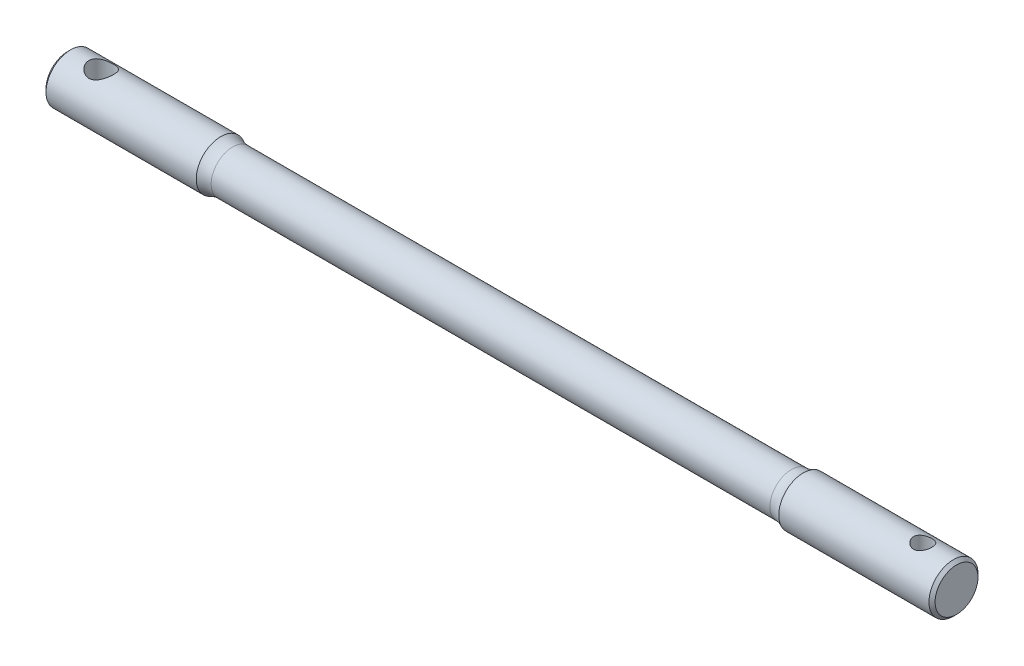
ISO-10303-21;
HEADER;
FILE_DESCRIPTION(('STEP AP214'),'2;1');
FILE_NAME('part.step','',(''),(''),'','','');
FILE_SCHEMA(('AUTOMOTIVE_DESIGN { 1 0 10303 214 1 1 1 1 }'));
ENDSEC;
DATA;
#1=APPLICATION_CONTEXT('core data for automotive mechanical design processes');
#2=APPLICATION_PROTOCOL_DEFINITION('international standard','automotive_design',2000,#1);
#3=PRODUCT_CONTEXT('',#1,'mechanical');
#4=PRODUCT('Part','Part','',(#3));
#5=PRODUCT_RELATED_PRODUCT_CATEGORY('part','',(#4));
#6=PRODUCT_DEFINITION_FORMATION('','',#4);
#7=PRODUCT_DEFINITION_CONTEXT('part definition',#1,'design');
#8=PRODUCT_DEFINITION('design','',#6,#7);
#9=PRODUCT_DEFINITION_SHAPE('','',#8);
#10=(LENGTH_UNIT() NAMED_UNIT(*) SI_UNIT(.MILLI.,.METRE.));
#11=(NAMED_UNIT(*) PLANE_ANGLE_UNIT() SI_UNIT($,.RADIAN.));
#12=(NAMED_UNIT(*) SI_UNIT($,.STERADIAN.) SOLID_ANGLE_UNIT());
#13=UNCERTAINTY_MEASURE_WITH_UNIT(LENGTH_MEASURE(1.E-05),#10,'distance_accuracy_value','');
#14=(GEOMETRIC_REPRESENTATION_CONTEXT(3) GLOBAL_UNCERTAINTY_ASSIGNED_CONTEXT((#13)) GLOBAL_UNIT_ASSIGNED_CONTEXT((#10,
#11,#12)) REPRESENTATION_CONTEXT('',''));
#15=CARTESIAN_POINT('',(0.,0.,0.));
#16=DIRECTION('',(0.,0.,1.));
#17=DIRECTION('',(1.,0.,0.));
#18=AXIS2_PLACEMENT_3D('',#15,#16,#17);
#19=CARTESIAN_POINT('',(0.,0.,0.));
#20=DIRECTION('',(1.,0.,0.));
#21=DIRECTION('',(0.,0.,-1.));
#22=AXIS2_PLACEMENT_3D('',#19,#20,#21);
#23=PLANE('',#22);
#24=CARTESIAN_POINT('',(0.,0.,0.));
#25=DIRECTION('',(1.,0.,0.));
#26=DIRECTION('',(0.,0.,-1.));
#27=AXIS2_PLACEMENT_3D('',#24,#25,#26);
#28=CIRCLE('',#27,3.49999999999999);
#29=CARTESIAN_POINT('',(0.,0.,-3.49999999999999));
#30=VERTEX_POINT('',#29);
#31=EDGE_CURVE('E37',#30,#30,#28,.T.);
#32=ORIENTED_EDGE('',*,*,#31,.T.);
#33=EDGE_LOOP('',(#32));
#34=FACE_BOUND('',#33,.T.);
#35=ADVANCED_FACE('F31',(#34),#23,.T.);
#36=CARTESIAN_POINT('',(36.,0.,0.));
#37=DIRECTION('',(1.,0.,0.));
#38=DIRECTION('',(0.,0.,-1.));
#39=AXIS2_PLACEMENT_3D('',#36,#37,#38);
#40=CYLINDRICAL_SURFACE('',#39,4.);
#41=CARTESIAN_POINT('',(-0.5,0.,0.));
#42=DIRECTION('',(1.,0.,0.));
#43=DIRECTION('',(0.,0.,-1.));
#44=AXIS2_PLACEMENT_3D('',#41,#42,#43);
#45=CIRCLE('',#44,4.);
#46=CARTESIAN_POINT('',(-0.5,0.,-4.));
#47=VERTEX_POINT('',#46);
#48=EDGE_CURVE('E10',#47,#47,#45,.F.);
#49=ORIENTED_EDGE('',*,*,#48,.T.);
#50=EDGE_LOOP('',(#49));
#51=FACE_BOUND('',#50,.T.);
#52=CARTESIAN_POINT('',(-5.5,3.70809924354783,1.5));
#53=CARTESIAN_POINT('',(-5.41899251627921,3.70809640633806,1.50000304106109));
#54=CARTESIAN_POINT('',(-5.33800507749636,3.71078260240986,1.49341597549487));
#55=CARTESIAN_POINT('',(-5.1784719170868,3.72116159304967,1.46736187895468));
#56=CARTESIAN_POINT('',(-5.09992612240499,3.72885423767112,1.44789523373263));
#57=CARTESIAN_POINT('',(-4.94762462838647,3.748254802809,1.39689657610574));
#58=CARTESIAN_POINT('',(-4.87385794334892,3.7599530956926,1.36539347266348));
#59=CARTESIAN_POINT('',(-4.73262810318116,3.78603134206598,1.29131856742698));
#60=CARTESIAN_POINT('',(-4.66516684971748,3.80041210067323,1.24874344095039));
#61=CARTESIAN_POINT('',(-4.53510968837718,3.83103574665713,1.15146661374162));
#62=CARTESIAN_POINT('',(-4.47287147037061,3.84733341923604,1.09630381213306));
#63=CARTESIAN_POINT('',(-4.35827718532851,3.87949750628547,0.976395839778927));
#64=CARTESIAN_POINT('',(-4.30592322625814,3.89536382814785,0.91164863025668));
#65=CARTESIAN_POINT('',(-4.21086048770439,3.92552873936553,0.771694655177601));
#66=CARTESIAN_POINT('',(-4.16854052528414,3.93975561223506,0.696206947538028));
#67=CARTESIAN_POINT('',(-4.09734882747509,3.96438007973848,0.538555771965248));
#68=CARTESIAN_POINT('',(-4.06847242800803,3.97477900217006,0.456394630933536));
#69=CARTESIAN_POINT('',(-4.02624210422538,3.9901869710344,0.291489341676833));
#70=CARTESIAN_POINT('',(-4.01227237255954,3.99540915214775,0.208923197281597));
#71=CARTESIAN_POINT('',(-3.99827879905501,4.0006401410794,0.0424643637947865));
#72=CARTESIAN_POINT('',(-3.99825042238129,4.00065064414902,-0.0414278850628326));
#73=CARTESIAN_POINT('',(-4.01178176146517,3.99559265903895,-0.203743543064476));
#74=CARTESIAN_POINT('',(-4.02466929794881,3.99077541996683,-0.2822321782669));
#75=CARTESIAN_POINT('',(-4.06253591522555,3.97693274932263,-0.435839217984391));
#76=CARTESIAN_POINT('',(-4.08751585226204,3.96790701975578,-0.510957383430298));
#77=CARTESIAN_POINT('',(-4.14917045167584,3.94637769167531,-0.656989017303104));
#78=CARTESIAN_POINT('',(-4.18601000526841,3.93382539470077,-0.727825392287309));
#79=CARTESIAN_POINT('',(-4.27019209692939,3.90651310225279,-0.862486607957559));
#80=CARTESIAN_POINT('',(-4.3175380230176,3.8917523951284,-0.926309176932323));
#81=CARTESIAN_POINT('',(-4.42462728628318,3.86052529655816,-1.04909048680094));
#82=CARTESIAN_POINT('',(-4.48493391565042,3.84400963763883,-1.10754614526348));
#83=CARTESIAN_POINT('',(-4.61459299332156,3.81182460645722,-1.21370395569342));
#84=CARTESIAN_POINT('',(-4.68394770658664,3.79615544748847,-1.261403406929));
#85=CARTESIAN_POINT('',(-4.83171946746282,3.76712703500335,-1.34565611808152));
#86=CARTESIAN_POINT('',(-4.91030349368607,3.75382677150277,-1.38193847851831));
#87=CARTESIAN_POINT('',(-5.07309622516757,3.73172438629003,-1.44056464441501));
#88=CARTESIAN_POINT('',(-5.15730177159369,3.72291976205783,-1.46291620605595));
#89=CARTESIAN_POINT('',(-5.32397596231595,3.71139597222848,-1.49190191709668));
#90=CARTESIAN_POINT('',(-5.40628410553614,3.70836785241537,-1.49933521158966));
#91=CARTESIAN_POINT('',(-5.57100935674174,3.70786539525016,-1.50057885636272));
#92=CARTESIAN_POINT('',(-5.65342643235247,3.71038967003987,-1.49439261093762));
#93=CARTESIAN_POINT('',(-5.81192992228768,3.72039381629735,-1.46929733520157));
#94=CARTESIAN_POINT('',(-5.88813113576466,3.72763276216449,-1.45100618334225));
#95=CARTESIAN_POINT('',(-6.03634794472019,3.74596487046362,-1.40299774640638));
#96=CARTESIAN_POINT('',(-6.10836267916813,3.75705882250173,-1.37327812034623));
#97=CARTESIAN_POINT('',(-6.24916443807621,3.7823624311608,-1.30200292275278));
#98=CARTESIAN_POINT('',(-6.31772929213734,3.79667328892065,-1.26004545177047));
#99=CARTESIAN_POINT('',(-6.44712898172604,3.82662814294291,-1.16591317862479));
#100=CARTESIAN_POINT('',(-6.50796097462463,3.84227262594077,-1.11373463696435));
#101=CARTESIAN_POINT('',(-6.6241683731951,3.87433046553184,-0.996727340900939));
#102=CARTESIAN_POINT('',(-6.67895340876875,3.89072969357028,-0.931306341491063));
#103=CARTESIAN_POINT('',(-6.77683836758944,3.92149874963302,-0.791797471753152));
#104=CARTESIAN_POINT('',(-6.81993825294584,3.93586857107664,-0.717709573322674));
#105=CARTESIAN_POINT('',(-6.89294605619961,3.96094985704552,-0.563016329468477));
#106=CARTESIAN_POINT('',(-6.9228991237926,3.9716738133801,-0.482434433064628));
#107=CARTESIAN_POINT('',(-6.96865641384992,3.98829436712571,-0.316881887523256));
#108=CARTESIAN_POINT('',(-6.9844672854224,3.99419323299413,-0.231913320723594));
#109=CARTESIAN_POINT('',(-7.00077440275483,4.00028407317073,-0.0653355852738166));
#110=CARTESIAN_POINT('',(-7.00210948305899,4.00078860953764,0.0161807680608444));
#111=CARTESIAN_POINT('',(-6.99158484055461,3.99684889809224,0.178226786412423));
#112=CARTESIAN_POINT('',(-6.97972670911414,3.9924052471313,0.258756569245256));
#113=CARTESIAN_POINT('',(-6.94374114850638,3.97921089603771,0.414548248377125));
#114=CARTESIAN_POINT('',(-6.91992009412164,3.97056791378018,0.489890731068834));
#115=CARTESIAN_POINT('',(-6.86098998661564,3.9498778362099,0.635515473006389));
#116=CARTESIAN_POINT('',(-6.82587879669525,3.93783009655664,0.705796771275542));
#117=CARTESIAN_POINT('',(-6.74368605649519,3.91090618300074,0.842540176994412));
#118=CARTESIAN_POINT('',(-6.69616335948585,3.89593240108829,0.908717548846849));
#119=CARTESIAN_POINT('',(-6.5911921698124,3.86499507694844,1.03241734752336));
#120=CARTESIAN_POINT('',(-6.53374013419213,3.84903118274027,1.0899366712559));
#121=CARTESIAN_POINT('',(-6.40693586835494,3.81688129739175,1.19781214236196));
#122=CARTESIAN_POINT('',(-6.33711559784569,3.8007280534916,1.24762999816025));
#123=CARTESIAN_POINT('',(-6.18958413042668,3.77098325003638,1.33484709556843));
#124=CARTESIAN_POINT('',(-6.11187211594652,3.75739195631217,1.37224504878157));
#125=CARTESIAN_POINT('',(-5.9470443190246,3.73402269853266,1.4346588697426));
#126=CARTESIAN_POINT('',(-5.85966563348822,3.7244380329086,1.45906002899523));
#127=CARTESIAN_POINT('',(-5.68151472804421,3.71147994336315,1.49172356722079));
#128=CARTESIAN_POINT('',(-5.59074478729001,3.70810242179736,1.49999659339571));
#129=CARTESIAN_POINT('',(-5.5,3.70809924354783,1.5));
#130=B_SPLINE_CURVE_WITH_KNOTS('',3,(#52,#53,#54,#55,#56,#57,#58,#59,#60,#61,#62,#63,#64,#65,
#66,#67,#68,#69,#70,#71,#72,#73,#74,#75,#76,#77,#78,#79,#80,#81,#82,#83,#84,#85,#86,#87,#88,#89,
#90,#91,#92,#93,#94,#95,#96,#97,#98,#99,#100,#101,#102,#103,#104,#105,#106,#107,#108,#109,#110,
#111,#112,#113,#114,#115,#116,#117,#118,#119,#120,#121,#122,#123,#124,#125,#126,#127,#128,#129),
.UNSPECIFIED.,.T.,.F.,(4,2,2,2,2,2,2,2,2,2,2,2,2,2,2,2,2,2,2,2,2,2,2,2,2,2,2,2,2,2,2,2,2,2,2,2,
2,2,4),(0.,0.242684541416169,0.485361814598854,0.727459856757029,0.969630679682932,
1.22274652401128,1.47591628822983,1.73770072136421,1.9993942638133,2.24980018489679,
2.50012465404857,2.73806472803194,2.97602165263335,3.21744131210668,3.45893893628976,
3.71456675065874,3.97025867827335,4.23162592252966,4.49284751635474,4.73965657740485,
4.98640395388884,5.22143845928199,5.45652113429526,5.70041561005822,5.94439948466355,
6.20385016993624,6.46330169650178,6.72185508890168,6.98028685560127,7.22365720549936,
7.4669982031948,7.70440274003891,7.94185223512831,8.18928323676987,8.43680270894965,
8.69738599542079,8.95799630544242,9.23003178870926,9.50188762323054),.UNSPECIFIED.);
#131=CARTESIAN_POINT('',(-5.5,3.70809924354783,1.5));
#132=VERTEX_POINT('',#131);
#133=EDGE_CURVE('E58',#132,#132,#130,.T.);
#134=ORIENTED_EDGE('',*,*,#133,.F.);
#135=EDGE_LOOP('',(#134));
#136=FACE_BOUND('',#135,.T.);
#137=CARTESIAN_POINT('',(-5.5,-3.70809924354783,1.5));
#138=CARTESIAN_POINT('',(-5.58100748372079,-3.70809640633806,1.50000304106109));
#139=CARTESIAN_POINT('',(-5.66199492250364,-3.71078260240986,1.49341597549487));
#140=CARTESIAN_POINT('',(-5.8215280829132,-3.72116159304967,1.46736187895468));
#141=CARTESIAN_POINT('',(-5.90007387759501,-3.72885423767112,1.44789523373263));
#142=CARTESIAN_POINT('',(-6.05237537161353,-3.748254802809,1.39689657610574));
#143=CARTESIAN_POINT('',(-6.12614205665108,-3.7599530956926,1.36539347266348));
#144=CARTESIAN_POINT('',(-6.26737189681884,-3.78603134206598,1.29131856742698));
#145=CARTESIAN_POINT('',(-6.33483315028252,-3.80041210067323,1.24874344095039));
#146=CARTESIAN_POINT('',(-6.46489031162282,-3.83103574665713,1.15146661374162));
#147=CARTESIAN_POINT('',(-6.52712852962939,-3.84733341923604,1.09630381213306));
#148=CARTESIAN_POINT('',(-6.64172281467149,-3.87949750628547,0.976395839778927));
#149=CARTESIAN_POINT('',(-6.69407677374185,-3.89536382814785,0.91164863025668));
#150=CARTESIAN_POINT('',(-6.78913951229561,-3.92552873936553,0.771694655177601));
#151=CARTESIAN_POINT('',(-6.83145947471586,-3.93975561223506,0.696206947538028));
#152=CARTESIAN_POINT('',(-6.90265117252491,-3.96438007973848,0.538555771965247));
#153=CARTESIAN_POINT('',(-6.93152757199198,-3.97477900217006,0.456394630933536));
#154=CARTESIAN_POINT('',(-6.97375789577462,-3.9901869710344,0.291489341676833));
#155=CARTESIAN_POINT('',(-6.98772762744046,-3.99540915214775,0.208923197281597));
#156=CARTESIAN_POINT('',(-7.00172120094499,-4.0006401410794,0.0424643637947865));
#157=CARTESIAN_POINT('',(-7.00174957761871,-4.00065064414902,-0.0414278850628326));
#158=CARTESIAN_POINT('',(-6.98821823853483,-3.99559265903895,-0.203743543064476));
#159=CARTESIAN_POINT('',(-6.97533070205119,-3.99077541996683,-0.2822321782669));
#160=CARTESIAN_POINT('',(-6.93746408477445,-3.97693274932263,-0.435839217984391));
#161=CARTESIAN_POINT('',(-6.91248414773796,-3.96790701975578,-0.510957383430298));
#162=CARTESIAN_POINT('',(-6.85082954832415,-3.94637769167531,-0.656989017303104));
#163=CARTESIAN_POINT('',(-6.81398999473159,-3.93382539470077,-0.727825392287309));
#164=CARTESIAN_POINT('',(-6.72980790307061,-3.90651310225279,-0.862486607957559));
#165=CARTESIAN_POINT('',(-6.6824619769824,-3.8917523951284,-0.926309176932323));
#166=CARTESIAN_POINT('',(-6.57537271371681,-3.86052529655816,-1.04909048680094));
#167=CARTESIAN_POINT('',(-6.51506608434958,-3.84400963763883,-1.10754614526348));
#168=CARTESIAN_POINT('',(-6.38540700667844,-3.81182460645722,-1.21370395569342));
#169=CARTESIAN_POINT('',(-6.31605229341336,-3.79615544748847,-1.261403406929));
#170=CARTESIAN_POINT('',(-6.16828053253718,-3.76712703500335,-1.34565611808152));
#171=CARTESIAN_POINT('',(-6.08969650631393,-3.75382677150277,-1.38193847851831));
#172=CARTESIAN_POINT('',(-5.92690377483243,-3.73172438629003,-1.44056464441501));
#173=CARTESIAN_POINT('',(-5.84269822840631,-3.72291976205783,-1.46291620605595));
#174=CARTESIAN_POINT('',(-5.67602403768405,-3.71139597222848,-1.49190191709668));
#175=CARTESIAN_POINT('',(-5.59371589446386,-3.70836785241537,-1.49933521158966));
#176=CARTESIAN_POINT('',(-5.42899064325826,-3.70786539525016,-1.50057885636272));
#177=CARTESIAN_POINT('',(-5.34657356764753,-3.71038967003987,-1.49439261093762));
#178=CARTESIAN_POINT('',(-5.18807007771232,-3.72039381629735,-1.46929733520157));
#179=CARTESIAN_POINT('',(-5.11186886423534,-3.72763276216449,-1.45100618334225));
#180=CARTESIAN_POINT('',(-4.96365205527981,-3.74596487046362,-1.40299774640638));
#181=CARTESIAN_POINT('',(-4.89163732083186,-3.75705882250173,-1.37327812034623));
#182=CARTESIAN_POINT('',(-4.75083556192379,-3.7823624311608,-1.30200292275278));
#183=CARTESIAN_POINT('',(-4.68227070786266,-3.79667328892065,-1.26004545177047));
#184=CARTESIAN_POINT('',(-4.55287101827396,-3.82662814294291,-1.16591317862479));
#185=CARTESIAN_POINT('',(-4.49203902537537,-3.84227262594077,-1.11373463696435));
#186=CARTESIAN_POINT('',(-4.3758316268049,-3.87433046553184,-0.996727340900939));
#187=CARTESIAN_POINT('',(-4.32104659123125,-3.89072969357028,-0.931306341491063));
#188=CARTESIAN_POINT('',(-4.22316163241056,-3.92149874963302,-0.791797471753152));
#189=CARTESIAN_POINT('',(-4.18006174705416,-3.93586857107664,-0.717709573322674));
#190=CARTESIAN_POINT('',(-4.10705394380039,-3.96094985704552,-0.563016329468477));
#191=CARTESIAN_POINT('',(-4.0771008762074,-3.9716738133801,-0.482434433064628));
#192=CARTESIAN_POINT('',(-4.03134358615008,-3.98829436712571,-0.316881887523256));
#193=CARTESIAN_POINT('',(-4.0155327145776,-3.99419323299413,-0.231913320723594));
#194=CARTESIAN_POINT('',(-3.99922559724517,-4.00028407317073,-0.0653355852738166));
#195=CARTESIAN_POINT('',(-3.99789051694101,-4.00078860953764,0.0161807680608445));
#196=CARTESIAN_POINT('',(-4.00841515944539,-3.99684889809224,0.178226786412423));
#197=CARTESIAN_POINT('',(-4.02027329088585,-3.9924052471313,0.258756569245256));
#198=CARTESIAN_POINT('',(-4.05625885149362,-3.97921089603771,0.414548248377125));
#199=CARTESIAN_POINT('',(-4.08007990587836,-3.97056791378018,0.489890731068834));
#200=CARTESIAN_POINT('',(-4.13901001338436,-3.9498778362099,0.635515473006389));
#201=CARTESIAN_POINT('',(-4.17412120330475,-3.93783009655664,0.705796771275542));
#202=CARTESIAN_POINT('',(-4.25631394350481,-3.91090618300074,0.842540176994412));
#203=CARTESIAN_POINT('',(-4.30383664051415,-3.89593240108829,0.908717548846849));
#204=CARTESIAN_POINT('',(-4.4088078301876,-3.86499507694844,1.03241734752336));
#205=CARTESIAN_POINT('',(-4.46625986580787,-3.84903118274027,1.0899366712559));
#206=CARTESIAN_POINT('',(-4.59306413164506,-3.81688129739175,1.19781214236196));
#207=CARTESIAN_POINT('',(-4.66288440215431,-3.8007280534916,1.24762999816025));
#208=CARTESIAN_POINT('',(-4.81041586957332,-3.77098325003638,1.33484709556843));
#209=CARTESIAN_POINT('',(-4.88812788405348,-3.75739195631217,1.37224504878157));
#210=CARTESIAN_POINT('',(-5.0529556809754,-3.73402269853266,1.4346588697426));
#211=CARTESIAN_POINT('',(-5.14033436651178,-3.7244380329086,1.45906002899523));
#212=CARTESIAN_POINT('',(-5.31848527195579,-3.71147994336315,1.49172356722079));
#213=CARTESIAN_POINT('',(-5.40925521270999,-3.70810242179736,1.49999659339571));
#214=CARTESIAN_POINT('',(-5.5,-3.70809924354783,1.5));
#215=B_SPLINE_CURVE_WITH_KNOTS('',3,(#137,#138,#139,#140,#141,#142,#143,#144,#145,#146,#147,
#148,#149,#150,#151,#152,#153,#154,#155,#156,#157,#158,#159,#160,#161,#162,#163,#164,#165,#166,
#167,#168,#169,#170,#171,#172,#173,#174,#175,#176,#177,#178,#179,#180,#181,#182,#183,#184,#185,
#186,#187,#188,#189,#190,#191,#192,#193,#194,#195,#196,#197,#198,#199,#200,#201,#202,#203,#204,
#205,#206,#207,#208,#209,#210,#211,#212,#213,#214),.UNSPECIFIED.,.T.,.F.,(4,2,2,2,2,2,2,2,2,2,2,
2,2,2,2,2,2,2,2,2,2,2,2,2,2,2,2,2,2,2,2,2,2,2,2,2,2,2,4),(0.,0.242684541416169,
0.485361814598854,0.727459856757029,0.969630679682932,1.22274652401128,1.47591628822983,
1.73770072136421,1.9993942638133,2.24980018489679,2.50012465404857,2.73806472803194,
2.97602165263335,3.21744131210668,3.45893893628976,3.71456675065874,3.97025867827335,
4.23162592252966,4.49284751635474,4.73965657740485,4.98640395388884,5.22143845928199,
5.45652113429526,5.70041561005822,5.94439948466355,6.20385016993624,6.46330169650178,
6.72185508890168,6.98028685560127,7.22365720549936,7.4669982031948,7.70440274003891,
7.94185223512831,8.18928323676987,8.43680270894965,8.69738599542079,8.95799630544242,
9.23003178870926,9.50188762323054),.UNSPECIFIED.);
#216=CARTESIAN_POINT('',(-5.5,-3.70809924354783,1.5));
#217=VERTEX_POINT('',#216);
#218=EDGE_CURVE('E82',#217,#217,#215,.T.);
#219=ORIENTED_EDGE('',*,*,#218,.F.);
#220=EDGE_LOOP('',(#219));
#221=FACE_BOUND('',#220,.T.);
#222=CARTESIAN_POINT('',(-25.,0.,0.));
#223=DIRECTION('',(1.,0.,0.));
#224=DIRECTION('',(0.,0.,-1.));
#225=AXIS2_PLACEMENT_3D('',#222,#223,#224);
#226=CIRCLE('',#225,4.);
#227=CARTESIAN_POINT('',(-25.,0.,-4.));
#228=VERTEX_POINT('',#227);
#229=EDGE_CURVE('E196',#228,#228,#226,.T.);
#230=ORIENTED_EDGE('',*,*,#229,.T.);
#231=EDGE_LOOP('',(#230));
#232=FACE_BOUND('',#231,.T.);
#233=ADVANCED_FACE('F90',(#51,#136,#221,#232),#40,.T.);
#234=CARTESIAN_POINT('',(-26.9364916731037,0.,0.));
#235=DIRECTION('',(1.,0.,0.));
#236=DIRECTION('',(0.,0.,-1.));
#237=AXIS2_PLACEMENT_3D('',#234,#235,#236);
#238=TOROIDAL_SURFACE('',#237,7.5,4.);
#239=ORIENTED_EDGE('',*,*,#229,.F.);
#240=EDGE_LOOP('',(#239));
#241=FACE_BOUND('',#240,.T.);
#242=CARTESIAN_POINT('',(-26.9364916731037,0.,0.));
#243=DIRECTION('',(1.,0.,0.));
#244=DIRECTION('',(0.,0.,-1.));
#245=AXIS2_PLACEMENT_3D('',#242,#243,#244);
#246=CIRCLE('',#245,3.5);
#247=CARTESIAN_POINT('',(-26.9364916731037,0.,-3.5));
#248=VERTEX_POINT('',#247);
#249=EDGE_CURVE('E192',#248,#248,#246,.T.);
#250=ORIENTED_EDGE('',*,*,#249,.T.);
#251=EDGE_LOOP('',(#250));
#252=FACE_BOUND('',#251,.T.);
#253=ADVANCED_FACE('F94',(#241,#252),#238,.F.);
#254=CARTESIAN_POINT('',(36.,0.,0.));
#255=DIRECTION('',(1.,0.,0.));
#256=DIRECTION('',(0.,0.,-1.));
#257=AXIS2_PLACEMENT_3D('',#254,#255,#256);
#258=CYLINDRICAL_SURFACE('',#257,3.50000000000001);
#259=CARTESIAN_POINT('',(-118.063508326896,0.,0.));
#260=DIRECTION('',(1.,0.,0.));
#261=DIRECTION('',(0.,0.,-1.));
#262=AXIS2_PLACEMENT_3D('',#259,#260,#261);
#263=CIRCLE('',#262,3.50000000000001);
#264=CARTESIAN_POINT('',(-118.063508326896,0.,-3.50000000000001));
#265=VERTEX_POINT('',#264);
#266=EDGE_CURVE('E189',#265,#265,#263,.T.);
#267=ORIENTED_EDGE('',*,*,#266,.T.);
#268=EDGE_LOOP('',(#267));
#269=FACE_BOUND('',#268,.T.);
#270=ORIENTED_EDGE('',*,*,#249,.F.);
#271=EDGE_LOOP('',(#270));
#272=FACE_BOUND('',#271,.T.);
#273=ADVANCED_FACE('F98',(#269,#272),#258,.T.);
#274=CARTESIAN_POINT('',(-118.063508326896,0.,0.));
#275=DIRECTION('',(1.,0.,0.));
#276=DIRECTION('',(0.,0.,-1.));
#277=AXIS2_PLACEMENT_3D('',#274,#275,#276);
#278=TOROIDAL_SURFACE('',#277,7.50000000000002,4.);
#279=ORIENTED_EDGE('',*,*,#266,.F.);
#280=EDGE_LOOP('',(#279));
#281=FACE_BOUND('',#280,.T.);
#282=CARTESIAN_POINT('',(-120.,0.,0.));
#283=DIRECTION('',(1.,0.,0.));
#284=DIRECTION('',(0.,0.,-1.));
#285=AXIS2_PLACEMENT_3D('',#282,#283,#284);
#286=CIRCLE('',#285,4.00000000000002);
#287=CARTESIAN_POINT('',(-120.,0.,-4.00000000000002));
#288=VERTEX_POINT('',#287);
#289=EDGE_CURVE('E89',#288,#288,#286,.T.);
#290=ORIENTED_EDGE('',*,*,#289,.T.);
#291=EDGE_LOOP('',(#290));
#292=FACE_BOUND('',#291,.T.);
#293=ADVANCED_FACE('F101',(#281,#292),#278,.F.);
#294=CARTESIAN_POINT('',(36.,0.,0.));
#295=DIRECTION('',(1.,0.,0.));
#296=DIRECTION('',(0.,0.,-1.));
#297=AXIS2_PLACEMENT_3D('',#294,#295,#296);
#298=CYLINDRICAL_SURFACE('',#297,4.00000000000002);
#299=CARTESIAN_POINT('',(-144.5,0.,0.));
#300=DIRECTION('',(-1.,0.,0.));
#301=DIRECTION('',(0.,0.,1.));
#302=AXIS2_PLACEMENT_3D('',#299,#300,#301);
#303=CIRCLE('',#302,4.00000000000002);
#304=CARTESIAN_POINT('',(-144.5,0.,4.00000000000002));
#305=VERTEX_POINT('',#304);
#306=EDGE_CURVE('E45',#305,#305,#303,.F.);
#307=ORIENTED_EDGE('',*,*,#306,.T.);
#308=EDGE_LOOP('',(#307));
#309=FACE_BOUND('',#308,.T.);
#310=CARTESIAN_POINT('',(-139.5,3.46410161513778,2.));
#311=CARTESIAN_POINT('',(-139.395786794526,3.4641118571589,1.99999158748781));
#312=CARTESIAN_POINT('',(-139.291437823466,3.4688763354498,1.99179963610436));
#313=CARTESIAN_POINT('',(-139.085944822769,3.48724701669074,1.95944672580052));
#314=CARTESIAN_POINT('',(-138.984807996752,3.50087179788185,1.93525221095662));
#315=CARTESIAN_POINT('',(-138.789096843553,3.53498701490003,1.8721998159803));
#316=CARTESIAN_POINT('',(-138.694490741151,3.5554408906917,1.83341988295964));
#317=CARTESIAN_POINT('',(-138.513151549524,3.60085327291134,1.74253507245139));
#318=CARTESIAN_POINT('',(-138.426418886563,3.62581202301255,1.69042947410139));
#319=CARTESIAN_POINT('',(-138.255388556867,3.67993738819291,1.56933307453801));
#320=CARTESIAN_POINT('',(-138.171881732408,3.70928127465105,1.49930407053533));
#321=CARTESIAN_POINT('',(-138.017183219429,3.76743965382123,1.34650761698202));
#322=CARTESIAN_POINT('',(-137.945997673796,3.7962538761026,1.26373385204842));
#323=CARTESIAN_POINT('',(-137.813265698811,3.85242953961663,1.08097912631265));
#324=CARTESIAN_POINT('',(-137.752692464577,3.87956212851247,0.980214377887152));
#325=CARTESIAN_POINT('',(-137.649718293213,3.92701512184169,0.768314053336919));
#326=CARTESIAN_POINT('',(-137.607305887649,3.94733982363633,0.657185076311995));
#327=CARTESIAN_POINT('',(-137.544990677469,3.97760922492055,0.436089887818835));
#328=CARTESIAN_POINT('',(-137.523700947308,3.98818960442741,0.326603580968803));
#329=CARTESIAN_POINT('',(-137.499667762631,4.00015167691181,0.105141257404557));
#330=CARTESIAN_POINT('',(-137.496913086404,4.00153893568936,-0.00683321168519254));
#331=CARTESIAN_POINT('',(-137.509493347945,3.99525963833126,-0.219665048849556));
#332=CARTESIAN_POINT('',(-137.523276031044,3.98836991784383,-0.32064239835412));
#333=CARTESIAN_POINT('',(-137.565761687808,3.96748490519437,-0.51862754383607));
#334=CARTESIAN_POINT('',(-137.594465777952,3.95348908132773,-0.615635042187686));
#335=CARTESIAN_POINT('',(-137.66616513218,3.91943166575327,-0.804618783139246));
#336=CARTESIAN_POINT('',(-137.709352626344,3.89928883058405,-0.896506847030382));
#337=CARTESIAN_POINT('',(-137.808526832403,3.85475291973372,-1.0719536030266));
#338=CARTESIAN_POINT('',(-137.864518126605,3.83035832314969,-1.15550929767726));
#339=CARTESIAN_POINT('',(-137.993790703066,3.77688788798462,-1.32034732179639));
#340=CARTESIAN_POINT('',(-138.068206056652,3.74758751996353,-1.40066815005872));
#341=CARTESIAN_POINT('',(-138.22917944986,3.68908681173625,-1.54820874059555));
#342=CARTESIAN_POINT('',(-138.315746744548,3.6598865653126,-1.61541842314845));
#343=CARTESIAN_POINT('',(-138.505296384848,3.60288312184972,-1.73901066928441));
#344=CARTESIAN_POINT('',(-138.608972046108,3.57528639981417,-1.7944346299561));
#345=CARTESIAN_POINT('',(-138.825875342718,3.52750900557154,-1.88663822600246));
#346=CARTESIAN_POINT('',(-138.939092866035,3.50732060092137,-1.92343731642177));
#347=CARTESIAN_POINT('',(-139.162429022566,3.47889271634071,-1.97436042205008));
#348=CARTESIAN_POINT('',(-139.272082238087,3.46983311696995,-1.99005024423995));
#349=CARTESIAN_POINT('',(-139.492802683033,3.46235838723221,-2.00303389322285));
#350=CARTESIAN_POINT('',(-139.60386885824,3.46393573778625,-2.00034071463005));
#351=CARTESIAN_POINT('',(-139.811307837157,3.47668673081172,-1.97807208668793));
#352=CARTESIAN_POINT('',(-139.907958902216,3.4867917501331,-1.96037563342492));
#353=CARTESIAN_POINT('',(-140.096735572542,3.51388043102684,-1.91139256926489));
#354=CARTESIAN_POINT('',(-140.188859701493,3.5308663201007,-1.88010155724726));
#355=CARTESIAN_POINT('',(-140.370822661805,3.57072444159315,-1.80329517720973));
#356=CARTESIAN_POINT('',(-140.460358033706,3.59383286486128,-1.7571881273853));
#357=CARTESIAN_POINT('',(-140.630938543079,3.64312238994502,-1.65257412803175));
#358=CARTESIAN_POINT('',(-140.71197928703,3.669305067103,-1.59406080866499));
#359=CARTESIAN_POINT('',(-140.873957535043,3.72575996912671,-1.45767433439708));
#360=CARTESIAN_POINT('',(-140.953594301418,3.75613166308568,-1.37829054462747));
#361=CARTESIAN_POINT('',(-141.098824476005,3.81468469955799,-1.20680899079903));
#362=CARTESIAN_POINT('',(-141.164413140527,3.84286530015465,-1.11470694931991));
#363=CARTESIAN_POINT('',(-141.281147451833,3.89482723381869,-0.917070725108071));
#364=CARTESIAN_POINT('',(-141.331866236167,3.91847283343885,-0.811246195112505));
#365=CARTESIAN_POINT('',(-141.41427580797,3.95766709918778,-0.591044729317874));
#366=CARTESIAN_POINT('',(-141.445983303684,3.97322287353399,-0.47667540291766));
#367=CARTESIAN_POINT('',(-141.486737127485,3.99335016363176,-0.253959364539771));
#368=CARTESIAN_POINT('',(-141.497595748664,3.99879855814272,-0.146022887268308));
#369=CARTESIAN_POINT('',(-141.501686533996,4.00084260752376,0.0702519714699353));
#370=CARTESIAN_POINT('',(-141.494924868529,3.99744136141636,0.178590198981603));
#371=CARTESIAN_POINT('',(-141.465167175684,3.98267937668511,0.385075986136845));
#372=CARTESIAN_POINT('',(-141.443270262691,3.97185789309445,0.483424641057403));
#373=CARTESIAN_POINT('',(-141.385346040193,3.94384187353389,0.67489189893155));
#374=CARTESIAN_POINT('',(-141.349316704293,3.92664642364426,0.768009749669759));
#375=CARTESIAN_POINT('',(-141.262545745009,3.88651861393183,0.950846833596729));
#376=CARTESIAN_POINT('',(-141.211240780248,3.86337234005406,1.04025036572289));
#377=CARTESIAN_POINT('',(-141.096084711882,3.81376266676029,1.20954920326827));
#378=CARTESIAN_POINT('',(-141.032227845898,3.78729774583429,1.28944011444319));
#379=CARTESIAN_POINT('',(-140.886403364441,3.73057218840584,1.44582833859495));
#380=CARTESIAN_POINT('',(-140.8032658192,3.70019591726077,1.52119665879198));
#381=CARTESIAN_POINT('',(-140.625107771694,3.64126158628574,1.65732528394005));
#382=CARTESIAN_POINT('',(-140.530076868639,3.61270515130786,1.71807266521243));
#383=CARTESIAN_POINT('',(-140.32669110587,3.55999186256754,1.8248671471681));
#384=CARTESIAN_POINT('',(-140.218010089265,3.53600256268538,1.87038902381912));
#385=CARTESIAN_POINT('',(-140.049421880369,3.50696218132373,1.92395929504799));
#386=CARTESIAN_POINT('',(-139.992352179409,3.49844389329403,1.93935666147966));
#387=CARTESIAN_POINT('',(-139.8767674425,3.48406059323538,1.96508069805042));
#388=CARTESIAN_POINT('',(-139.818253447246,3.47819372636053,1.97541091343282));
#389=CARTESIAN_POINT('',(-139.716399210753,3.4705902366876,1.9887293296122));
#390=CARTESIAN_POINT('',(-139.67326694275,3.46816389731818,1.99295091983786));
#391=CARTESIAN_POINT('',(-139.586764306907,3.46491740045179,1.99858810035606));
#392=CARTESIAN_POINT('',(-139.543393923333,3.46409735040494,2.00000350293331));
#393=CARTESIAN_POINT('',(-139.5,3.46410161513778,2.));
#394=B_SPLINE_CURVE_WITH_KNOTS('',3,(#310,#311,#312,#313,#314,#315,#316,#317,#318,#319,#320,
#321,#322,#323,#324,#325,#326,#327,#328,#329,#330,#331,#332,#333,#334,#335,#336,#337,#338,#339,
#340,#341,#342,#343,#344,#345,#346,#347,#348,#349,#350,#351,#352,#353,#354,#355,#356,#357,#358,
#359,#360,#361,#362,#363,#364,#365,#366,#367,#368,#369,#370,#371,#372,#373,#374,#375,#376,#377,
#378,#379,#380,#381,#382,#383,#384,#385,#386,#387,#388,#389,#390,#391,#392,#393),.UNSPECIFIED.,
.T.,.F.,(4,2,2,2,2,2,2,2,2,2,2,2,2,2,2,2,2,2,2,2,2,2,2,2,2,2,2,2,2,2,2,2,2,2,2,2,2,2,2,2,2,4),
(0.,0.31246424518942,0.625585785649595,0.937057191861522,1.24854545093095,1.58572462503711,
1.92307142172808,2.28315784481594,2.64301653931846,2.97726969939935,3.31132047376145,
3.61632194973141,3.92134625038974,4.23059069466358,4.53994598704608,4.87854382917847,
5.21740096495901,5.57777683462962,5.93777548427473,6.26924581712486,6.6004818638081,
6.89548366852116,7.19058104876188,7.49934592816239,7.80826972444159,8.15613487165293,
8.50411729960466,8.86128362829993,9.21813559621606,9.54224540783036,9.86624173592006,
10.1688884974705,10.4715786702809,10.7872150144301,11.102996602055,11.450204837042,
11.7977188569437,12.1562149808127,12.3351395323571,12.5139387197525,12.6440387634035,
12.7741475095882),.UNSPECIFIED.);
#395=CARTESIAN_POINT('',(-139.5,3.46410161513778,2.));
#396=VERTEX_POINT('',#395);
#397=EDGE_CURVE('E51',#396,#396,#394,.T.);
#398=ORIENTED_EDGE('',*,*,#397,.F.);
#399=EDGE_LOOP('',(#398));
#400=FACE_BOUND('',#399,.T.);
#401=CARTESIAN_POINT('',(-139.5,-3.46410161513778,2.));
#402=CARTESIAN_POINT('',(-139.604213205474,-3.4641118571589,1.99999158748781));
#403=CARTESIAN_POINT('',(-139.708562176534,-3.4688763354498,1.99179963610436));
#404=CARTESIAN_POINT('',(-139.914055177231,-3.48724701669074,1.95944672580052));
#405=CARTESIAN_POINT('',(-140.015192003248,-3.50087179788185,1.93525221095662));
#406=CARTESIAN_POINT('',(-140.210903156447,-3.53498701490003,1.8721998159803));
#407=CARTESIAN_POINT('',(-140.305509258849,-3.5554408906917,1.83341988295964));
#408=CARTESIAN_POINT('',(-140.486848450476,-3.60085327291134,1.74253507245139));
#409=CARTESIAN_POINT('',(-140.573581113437,-3.62581202301255,1.69042947410139));
#410=CARTESIAN_POINT('',(-140.744611443133,-3.67993738819291,1.569333074538));
#411=CARTESIAN_POINT('',(-140.828118267592,-3.70928127465105,1.49930407053533));
#412=CARTESIAN_POINT('',(-140.982816780571,-3.76743965382123,1.34650761698202));
#413=CARTESIAN_POINT('',(-141.054002326204,-3.7962538761026,1.26373385204842));
#414=CARTESIAN_POINT('',(-141.186734301188,-3.85242953961662,1.08097912631266));
#415=CARTESIAN_POINT('',(-141.247307535423,-3.87956212851246,0.98021437788717));
#416=CARTESIAN_POINT('',(-141.350281706787,-3.92701512184169,0.76831405333694));
#417=CARTESIAN_POINT('',(-141.392694112351,-3.94733982363633,0.657185076312007));
#418=CARTESIAN_POINT('',(-141.455009322531,-3.97760922492054,0.436089887818836));
#419=CARTESIAN_POINT('',(-141.476299052692,-3.98818960442741,0.326603580968804));
#420=CARTESIAN_POINT('',(-141.500332237369,-4.00015167691181,0.105141257404557));
#421=CARTESIAN_POINT('',(-141.503086913596,-4.00153893568936,-0.00683321168519256));
#422=CARTESIAN_POINT('',(-141.490506652055,-3.99525963833126,-0.219665048849558));
#423=CARTESIAN_POINT('',(-141.476723968956,-3.98836991784383,-0.320642398354124));
#424=CARTESIAN_POINT('',(-141.434238312192,-3.96748490519437,-0.518627543836074));
#425=CARTESIAN_POINT('',(-141.405534222048,-3.95348908132773,-0.615635042187688));
#426=CARTESIAN_POINT('',(-141.33383486782,-3.91943166575327,-0.804618783139245));
#427=CARTESIAN_POINT('',(-141.290647373656,-3.89928883058405,-0.896506847030382));
#428=CARTESIAN_POINT('',(-141.191473167597,-3.85475291973372,-1.0719536030266));
#429=CARTESIAN_POINT('',(-141.135481873395,-3.83035832314969,-1.15550929767726));
#430=CARTESIAN_POINT('',(-141.006209296934,-3.77688788798462,-1.32034732179639));
#431=CARTESIAN_POINT('',(-140.931793943348,-3.74758751996353,-1.40066815005872));
#432=CARTESIAN_POINT('',(-140.77082055014,-3.68908681173625,-1.54820874059555));
#433=CARTESIAN_POINT('',(-140.684253255452,-3.6598865653126,-1.61541842314845));
#434=CARTESIAN_POINT('',(-140.494703615152,-3.60288312184972,-1.73901066928441));
#435=CARTESIAN_POINT('',(-140.391027953892,-3.57528639981417,-1.7944346299561));
#436=CARTESIAN_POINT('',(-140.174124657282,-3.52750900557154,-1.88663822600246));
#437=CARTESIAN_POINT('',(-140.060907133965,-3.50732060092137,-1.92343731642177));
#438=CARTESIAN_POINT('',(-139.837570977434,-3.47889271634071,-1.97436042205008));
#439=CARTESIAN_POINT('',(-139.727917761913,-3.46983311696995,-1.99005024423995));
#440=CARTESIAN_POINT('',(-139.507197316967,-3.46235838723221,-2.00303389322285));
#441=CARTESIAN_POINT('',(-139.39613114176,-3.46393573778625,-2.00034071463005));
#442=CARTESIAN_POINT('',(-139.188692162843,-3.47668673081172,-1.97807208668793));
#443=CARTESIAN_POINT('',(-139.092041097784,-3.4867917501331,-1.96037563342492));
#444=CARTESIAN_POINT('',(-138.903264427458,-3.51388043102684,-1.91139256926489));
#445=CARTESIAN_POINT('',(-138.811140298507,-3.5308663201007,-1.88010155724726));
#446=CARTESIAN_POINT('',(-138.629177338195,-3.57072444159315,-1.80329517720973));
#447=CARTESIAN_POINT('',(-138.539641966294,-3.59383286486128,-1.7571881273853));
#448=CARTESIAN_POINT('',(-138.369061456921,-3.64312238994502,-1.65257412803175));
#449=CARTESIAN_POINT('',(-138.288020712969,-3.669305067103,-1.59406080866499));
#450=CARTESIAN_POINT('',(-138.126042464957,-3.7257599691267,-1.4576743343971));
#451=CARTESIAN_POINT('',(-138.046405698582,-3.75613166308567,-1.3782905446275));
#452=CARTESIAN_POINT('',(-137.901175523995,-3.81468469955798,-1.20680899079906));
#453=CARTESIAN_POINT('',(-137.835586859473,-3.84286530015465,-1.11470694931993));
#454=CARTESIAN_POINT('',(-137.718852548167,-3.89482723381869,-0.917070725108073));
#455=CARTESIAN_POINT('',(-137.668133763833,-3.91847283343885,-0.811246195112506));
#456=CARTESIAN_POINT('',(-137.58572419203,-3.95766709918778,-0.591044729317873));
#457=CARTESIAN_POINT('',(-137.554016696316,-3.97322287353399,-0.47667540291766));
#458=CARTESIAN_POINT('',(-137.513262872515,-3.99335016363176,-0.253959364539771));
#459=CARTESIAN_POINT('',(-137.502404251336,-3.99879855814272,-0.146022887268309));
#460=CARTESIAN_POINT('',(-137.498313466004,-4.00084260752376,0.070251971469935));
#461=CARTESIAN_POINT('',(-137.505075131471,-3.99744136141636,0.178590198981603));
#462=CARTESIAN_POINT('',(-137.534832824316,-3.98267937668511,0.385075986136845));
#463=CARTESIAN_POINT('',(-137.556729737309,-3.97185789309445,0.483424641057403));
#464=CARTESIAN_POINT('',(-137.614653959807,-3.94384187353389,0.67489189893155));
#465=CARTESIAN_POINT('',(-137.650683295707,-3.92664642364426,0.768009749669759));
#466=CARTESIAN_POINT('',(-137.737454254991,-3.88651861393183,0.950846833596729));
#467=CARTESIAN_POINT('',(-137.788759219752,-3.86337234005406,1.04025036572289));
#468=CARTESIAN_POINT('',(-137.903915288118,-3.81376266676029,1.20954920326827));
#469=CARTESIAN_POINT('',(-137.967772154102,-3.78729774583429,1.28944011444319));
#470=CARTESIAN_POINT('',(-138.113596635559,-3.73057218840584,1.44582833859495));
#471=CARTESIAN_POINT('',(-138.1967341808,-3.70019591726077,1.52119665879198));
#472=CARTESIAN_POINT('',(-138.374892228306,-3.64126158628574,1.65732528394005));
#473=CARTESIAN_POINT('',(-138.469923131361,-3.61270515130786,1.71807266521243));
#474=CARTESIAN_POINT('',(-138.67330889413,-3.55999186256754,1.8248671471681));
#475=CARTESIAN_POINT('',(-138.781989910735,-3.53600256268538,1.87038902381912));
#476=CARTESIAN_POINT('',(-138.950578119631,-3.50696218132373,1.92395929504799));
#477=CARTESIAN_POINT('',(-139.007647820591,-3.49844389329403,1.93935666147966));
#478=CARTESIAN_POINT('',(-139.1232325575,-3.48406059323538,1.96508069805042));
#479=CARTESIAN_POINT('',(-139.181746552754,-3.47819372636053,1.97541091343282));
#480=CARTESIAN_POINT('',(-139.283600789247,-3.4705902366876,1.9887293296122));
#481=CARTESIAN_POINT('',(-139.32673305725,-3.46816389731818,1.99295091983786));
#482=CARTESIAN_POINT('',(-139.413235693093,-3.46491740045179,1.99858810035606));
#483=CARTESIAN_POINT('',(-139.456606076667,-3.46409735040494,2.00000350293331));
#484=CARTESIAN_POINT('',(-139.5,-3.46410161513778,2.));
#485=B_SPLINE_CURVE_WITH_KNOTS('',3,(#401,#402,#403,#404,#405,#406,#407,#408,#409,#410,#411,
#412,#413,#414,#415,#416,#417,#418,#419,#420,#421,#422,#423,#424,#425,#426,#427,#428,#429,#430,
#431,#432,#433,#434,#435,#436,#437,#438,#439,#440,#441,#442,#443,#444,#445,#446,#447,#448,#449,
#450,#451,#452,#453,#454,#455,#456,#457,#458,#459,#460,#461,#462,#463,#464,#465,#466,#467,#468,
#469,#470,#471,#472,#473,#474,#475,#476,#477,#478,#479,#480,#481,#482,#483,#484),.UNSPECIFIED.,
.T.,.F.,(4,2,2,2,2,2,2,2,2,2,2,2,2,2,2,2,2,2,2,2,2,2,2,2,2,2,2,2,2,2,2,2,2,2,2,2,2,2,2,2,2,4),
(0.,0.31246424518942,0.625585785649595,0.937057191861521,1.24854545093095,1.58572462503712,
1.92307142172808,2.28315784481589,2.64301653931846,2.97726969939935,3.31132047376144,
3.61632194973141,3.92134625038974,4.23059069466358,4.53994598704608,4.87854382917847,
5.21740096495901,5.57777683462962,5.93777548427473,6.26924581712486,6.6004818638081,
6.89548366852116,7.19058104876187,7.49934592816239,7.80826972444159,8.15613487165285,
8.50411729960466,8.86128362829993,9.21813559621606,9.54224540783036,9.86624173592006,
10.1688884974705,10.4715786702809,10.7872150144301,11.102996602055,11.450204837042,
11.7977188569437,12.1562149808127,12.3351395323571,12.5139387197525,12.6440387634035,
12.7741475095882),.UNSPECIFIED.);
#486=CARTESIAN_POINT('',(-139.5,-3.46410161513778,2.));
#487=VERTEX_POINT('',#486);
#488=EDGE_CURVE('E50',#487,#487,#485,.T.);
#489=ORIENTED_EDGE('',*,*,#488,.F.);
#490=EDGE_LOOP('',(#489));
#491=FACE_BOUND('',#490,.T.);
#492=ORIENTED_EDGE('',*,*,#289,.F.);
#493=EDGE_LOOP('',(#492));
#494=FACE_BOUND('',#493,.T.);
#495=ADVANCED_FACE('F62',(#309,#400,#491,#494),#298,.T.);
#496=CARTESIAN_POINT('',(-145.,4.00000000000002,0.));
#497=DIRECTION('',(-1.,0.,0.));
#498=DIRECTION('',(0.,0.,1.));
#499=AXIS2_PLACEMENT_3D('',#496,#497,#498);
#500=PLANE('',#499);
#501=CARTESIAN_POINT('',(-145.,0.,0.));
#502=DIRECTION('',(-1.,0.,0.));
#503=DIRECTION('',(0.,0.,1.));
#504=AXIS2_PLACEMENT_3D('',#501,#502,#503);
#505=CIRCLE('',#504,3.50000000000001);
#506=CARTESIAN_POINT('',(-145.,0.,3.50000000000001));
#507=VERTEX_POINT('',#506);
#508=EDGE_CURVE('E41',#507,#507,#505,.T.);
#509=ORIENTED_EDGE('',*,*,#508,.T.);
#510=EDGE_LOOP('',(#509));
#511=FACE_BOUND('',#510,.T.);
#512=ADVANCED_FACE('F78',(#511),#500,.T.);
#513=CARTESIAN_POINT('',(-5.5,-4.00000000000002,0.));
#514=DIRECTION('',(0.,1.,0.));
#515=DIRECTION('',(0.,0.,1.));
#516=AXIS2_PLACEMENT_3D('',#513,#514,#515);
#517=CYLINDRICAL_SURFACE('',#516,1.5);
#518=ORIENTED_EDGE('',*,*,#218,.T.);
#519=EDGE_LOOP('',(#518));
#520=FACE_BOUND('',#519,.T.);
#521=ORIENTED_EDGE('',*,*,#133,.T.);
#522=EDGE_LOOP('',(#521));
#523=FACE_BOUND('',#522,.T.);
#524=ADVANCED_FACE('F72',(#520,#523),#517,.F.);
#525=CARTESIAN_POINT('',(-139.5,-4.00000000000002,0.));
#526=DIRECTION('',(0.,1.,0.));
#527=DIRECTION('',(0.,0.,1.));
#528=AXIS2_PLACEMENT_3D('',#525,#526,#527);
#529=CYLINDRICAL_SURFACE('',#528,2.);
#530=ORIENTED_EDGE('',*,*,#488,.T.);
#531=EDGE_LOOP('',(#530));
#532=FACE_BOUND('',#531,.T.);
#533=ORIENTED_EDGE('',*,*,#397,.T.);
#534=EDGE_LOOP('',(#533));
#535=FACE_BOUND('',#534,.T.);
#536=ADVANCED_FACE('F66',(#532,#535),#529,.F.);
#537=CARTESIAN_POINT('',(-144.5,0.,0.));
#538=DIRECTION('',(1.,0.,0.));
#539=DIRECTION('',(0.,0.,-1.));
#540=AXIS2_PLACEMENT_3D('',#537,#538,#539);
#541=CONICAL_SURFACE('',#540,4.00000000000002,0.785398163397451);
#542=ORIENTED_EDGE('',*,*,#508,.F.);
#543=EDGE_LOOP('',(#542));
#544=FACE_BOUND('',#543,.T.);
#545=ORIENTED_EDGE('',*,*,#306,.F.);
#546=EDGE_LOOP('',(#545));
#547=FACE_BOUND('',#546,.T.);
#548=ADVANCED_FACE('F71',(#544,#547),#541,.T.);
#549=CARTESIAN_POINT('',(0.,0.,0.));
#550=DIRECTION('',(-1.,0.,0.));
#551=DIRECTION('',(0.,0.,1.));
#552=AXIS2_PLACEMENT_3D('',#549,#550,#551);
#553=CONICAL_SURFACE('',#552,3.49999999999999,0.785398163397457);
#554=ORIENTED_EDGE('',*,*,#48,.F.);
#555=EDGE_LOOP('',(#554));
#556=FACE_BOUND('',#555,.T.);
#557=ORIENTED_EDGE('',*,*,#31,.F.);
#558=EDGE_LOOP('',(#557));
#559=FACE_BOUND('',#558,.T.);
#560=ADVANCED_FACE('F165',(#556,#559),#553,.T.);
#561=CLOSED_SHELL('',(#35,#233,#253,#273,#293,#495,#512,#524,#536,#548,#560));
#562=MANIFOLD_SOLID_BREP('B2',#561);
#563=ADVANCED_BREP_SHAPE_REPRESENTATION('',(#18,#562),#14);
#564=SHAPE_DEFINITION_REPRESENTATION(#9,#563);
ENDSEC;
END-ISO-10303-21;
